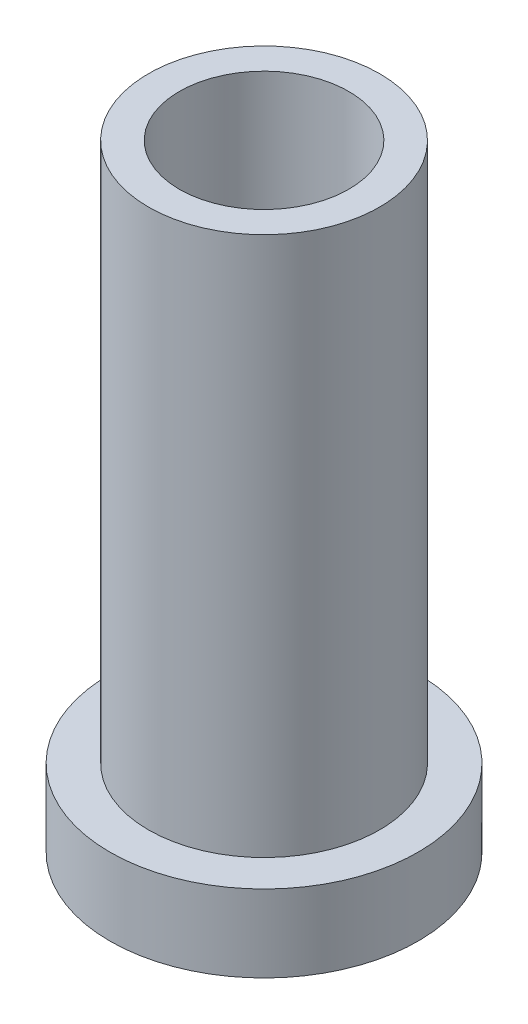
ISO-10303-21;
HEADER;
FILE_DESCRIPTION(('STEP AP214'),'2;1');
FILE_NAME('part.step','',(''),(''),'','','');
FILE_SCHEMA(('AUTOMOTIVE_DESIGN { 1 0 10303 214 1 1 1 1 }'));
ENDSEC;
DATA;
#1=APPLICATION_CONTEXT('core data for automotive mechanical design processes');
#2=APPLICATION_PROTOCOL_DEFINITION('international standard','automotive_design',2000,#1);
#3=PRODUCT_CONTEXT('',#1,'mechanical');
#4=PRODUCT('Part','Part','',(#3));
#5=PRODUCT_RELATED_PRODUCT_CATEGORY('part','',(#4));
#6=PRODUCT_DEFINITION_FORMATION('','',#4);
#7=PRODUCT_DEFINITION_CONTEXT('part definition',#1,'design');
#8=PRODUCT_DEFINITION('design','',#6,#7);
#9=PRODUCT_DEFINITION_SHAPE('','',#8);
#10=(LENGTH_UNIT() NAMED_UNIT(*) SI_UNIT(.MILLI.,.METRE.));
#11=(NAMED_UNIT(*) PLANE_ANGLE_UNIT() SI_UNIT($,.RADIAN.));
#12=(NAMED_UNIT(*) SI_UNIT($,.STERADIAN.) SOLID_ANGLE_UNIT());
#13=UNCERTAINTY_MEASURE_WITH_UNIT(LENGTH_MEASURE(1.E-05),#10,'distance_accuracy_value','');
#14=(GEOMETRIC_REPRESENTATION_CONTEXT(3) GLOBAL_UNCERTAINTY_ASSIGNED_CONTEXT((#13)) GLOBAL_UNIT_ASSIGNED_CONTEXT((#10,
#11,#12)) REPRESENTATION_CONTEXT('',''));
#15=CARTESIAN_POINT('',(0.,0.,0.));
#16=DIRECTION('',(0.,0.,1.));
#17=DIRECTION('',(1.,0.,0.));
#18=AXIS2_PLACEMENT_3D('',#15,#16,#17);
#19=CARTESIAN_POINT('',(-7.28583859910259E-13,5.,0.));
#20=DIRECTION('',(0.,-1.,0.));
#21=DIRECTION('',(0.,0.,-1.));
#22=AXIS2_PLACEMENT_3D('',#19,#20,#21);
#23=CYLINDRICAL_SURFACE('',#22,10.);
#24=CARTESIAN_POINT('',(-7.28583859910259E-13,5.,0.));
#25=DIRECTION('',(0.,1.,0.));
#26=DIRECTION('',(0.,0.,1.));
#27=AXIS2_PLACEMENT_3D('',#24,#25,#26);
#28=CIRCLE('',#27,10.);
#29=CARTESIAN_POINT('',(-7.28583859910259E-13,5.,10.));
#30=VERTEX_POINT('',#29);
#31=EDGE_CURVE('E65',#30,#30,#28,.T.);
#32=ORIENTED_EDGE('',*,*,#31,.F.);
#33=EDGE_LOOP('',(#32));
#34=FACE_BOUND('',#33,.T.);
#35=CARTESIAN_POINT('',(0.,0.,0.));
#36=DIRECTION('',(0.,1.,0.));
#37=DIRECTION('',(0.,0.,1.));
#38=AXIS2_PLACEMENT_3D('',#35,#36,#37);
#39=CIRCLE('',#38,10.);
#40=CARTESIAN_POINT('',(0.,0.,10.));
#41=VERTEX_POINT('',#40);
#42=EDGE_CURVE('E60',#41,#41,#39,.T.);
#43=ORIENTED_EDGE('',*,*,#42,.T.);
#44=EDGE_LOOP('',(#43));
#45=FACE_BOUND('',#44,.T.);
#46=ADVANCED_FACE('F57',(#34,#45),#23,.T.);
#47=CARTESIAN_POINT('',(-7.28583859910259E-13,5.,0.));
#48=DIRECTION('',(0.,1.,0.));
#49=DIRECTION('',(0.,0.,1.));
#50=AXIS2_PLACEMENT_3D('',#47,#48,#49);
#51=PLANE('',#50);
#52=CARTESIAN_POINT('',(-7.28583859910259E-13,5.,0.));
#53=DIRECTION('',(0.,1.,0.));
#54=DIRECTION('',(0.,0.,1.));
#55=AXIS2_PLACEMENT_3D('',#52,#53,#54);
#56=CIRCLE('',#55,7.5);
#57=CARTESIAN_POINT('',(-7.28583859910259E-13,5.,7.5));
#58=VERTEX_POINT('',#57);
#59=EDGE_CURVE('E12',#58,#58,#56,.T.);
#60=ORIENTED_EDGE('',*,*,#59,.F.);
#61=EDGE_LOOP('',(#60));
#62=FACE_BOUND('',#61,.T.);
#63=ORIENTED_EDGE('',*,*,#31,.T.);
#64=EDGE_LOOP('',(#63));
#65=FACE_BOUND('',#64,.T.);
#66=ADVANCED_FACE('F110',(#62,#65),#51,.T.);
#67=CARTESIAN_POINT('',(0.,0.,0.));
#68=DIRECTION('',(0.,1.,0.));
#69=DIRECTION('',(0.,0.,1.));
#70=AXIS2_PLACEMENT_3D('',#67,#68,#69);
#71=PLANE('',#70);
#72=CARTESIAN_POINT('',(0.,0.,0.));
#73=DIRECTION('',(0.,1.,0.));
#74=DIRECTION('',(0.,0.,1.));
#75=AXIS2_PLACEMENT_3D('',#72,#73,#74);
#76=CIRCLE('',#75,5.5);
#77=CARTESIAN_POINT('',(0.,0.,5.5));
#78=VERTEX_POINT('',#77);
#79=EDGE_CURVE('E78',#78,#78,#76,.T.);
#80=ORIENTED_EDGE('',*,*,#79,.T.);
#81=EDGE_LOOP('',(#80));
#82=FACE_BOUND('',#81,.T.);
#83=ORIENTED_EDGE('',*,*,#42,.F.);
#84=EDGE_LOOP('',(#83));
#85=FACE_BOUND('',#84,.T.);
#86=ADVANCED_FACE('F89',(#82,#85),#71,.F.);
#87=CARTESIAN_POINT('',(0.,40.,0.));
#88=DIRECTION('',(0.,-1.,0.));
#89=DIRECTION('',(0.,0.,-1.));
#90=AXIS2_PLACEMENT_3D('',#87,#88,#89);
#91=CYLINDRICAL_SURFACE('',#90,7.5);
#92=CARTESIAN_POINT('',(0.,40.,0.));
#93=DIRECTION('',(0.,1.,0.));
#94=DIRECTION('',(0.,0.,1.));
#95=AXIS2_PLACEMENT_3D('',#92,#93,#94);
#96=CIRCLE('',#95,7.5);
#97=CARTESIAN_POINT('',(0.,40.,7.5));
#98=VERTEX_POINT('',#97);
#99=EDGE_CURVE('E74',#98,#98,#96,.T.);
#100=ORIENTED_EDGE('',*,*,#99,.F.);
#101=EDGE_LOOP('',(#100));
#102=FACE_BOUND('',#101,.T.);
#103=ORIENTED_EDGE('',*,*,#59,.T.);
#104=EDGE_LOOP('',(#103));
#105=FACE_BOUND('',#104,.T.);
#106=ADVANCED_FACE('F101',(#102,#105),#91,.T.);
#107=CARTESIAN_POINT('',(0.,40.,0.));
#108=DIRECTION('',(0.,1.,0.));
#109=DIRECTION('',(0.,0.,1.));
#110=AXIS2_PLACEMENT_3D('',#107,#108,#109);
#111=PLANE('',#110);
#112=CARTESIAN_POINT('',(0.,40.,0.));
#113=DIRECTION('',(0.,1.,0.));
#114=DIRECTION('',(0.,0.,1.));
#115=AXIS2_PLACEMENT_3D('',#112,#113,#114);
#116=CIRCLE('',#115,5.5);
#117=CARTESIAN_POINT('',(0.,40.,5.5));
#118=VERTEX_POINT('',#117);
#119=EDGE_CURVE('E79',#118,#118,#116,.T.);
#120=ORIENTED_EDGE('',*,*,#119,.F.);
#121=EDGE_LOOP('',(#120));
#122=FACE_BOUND('',#121,.T.);
#123=ORIENTED_EDGE('',*,*,#99,.T.);
#124=EDGE_LOOP('',(#123));
#125=FACE_BOUND('',#124,.T.);
#126=ADVANCED_FACE('F95',(#122,#125),#111,.T.);
#127=CARTESIAN_POINT('',(0.,0.,0.));
#128=DIRECTION('',(0.,1.,0.));
#129=DIRECTION('',(0.,0.,1.));
#130=AXIS2_PLACEMENT_3D('',#127,#128,#129);
#131=CYLINDRICAL_SURFACE('',#130,5.5);
#132=ORIENTED_EDGE('',*,*,#79,.F.);
#133=EDGE_LOOP('',(#132));
#134=FACE_BOUND('',#133,.T.);
#135=ORIENTED_EDGE('',*,*,#119,.T.);
#136=EDGE_LOOP('',(#135));
#137=FACE_BOUND('',#136,.T.);
#138=ADVANCED_FACE('F92',(#134,#137),#131,.F.);
#139=CLOSED_SHELL('',(#46,#66,#86,#106,#126,#138));
#140=MANIFOLD_SOLID_BREP('B2',#139);
#141=ADVANCED_BREP_SHAPE_REPRESENTATION('',(#18,#140),#14);
#142=SHAPE_DEFINITION_REPRESENTATION(#9,#141);
ENDSEC;
END-ISO-10303-21;
